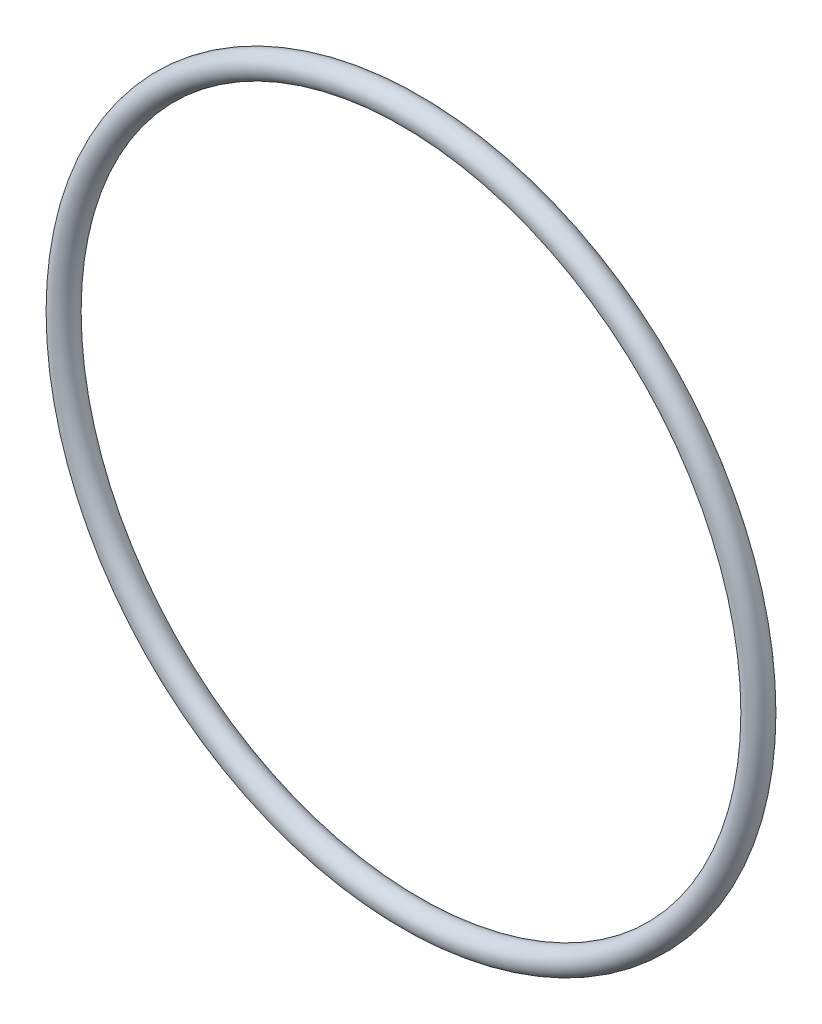
ISO-10303-21;
HEADER;
FILE_DESCRIPTION(('STEP AP214'),'2;1');
FILE_NAME('part.step','',(''),(''),'','','');
FILE_SCHEMA(('AUTOMOTIVE_DESIGN { 1 0 10303 214 1 1 1 1 }'));
ENDSEC;
DATA;
#1=APPLICATION_CONTEXT('core data for automotive mechanical design processes');
#2=APPLICATION_PROTOCOL_DEFINITION('international standard','automotive_design',2000,#1);
#3=PRODUCT_CONTEXT('',#1,'mechanical');
#4=PRODUCT('Part','Part','',(#3));
#5=PRODUCT_RELATED_PRODUCT_CATEGORY('part','',(#4));
#6=PRODUCT_DEFINITION_FORMATION('','',#4);
#7=PRODUCT_DEFINITION_CONTEXT('part definition',#1,'design');
#8=PRODUCT_DEFINITION('design','',#6,#7);
#9=PRODUCT_DEFINITION_SHAPE('','',#8);
#10=(LENGTH_UNIT() NAMED_UNIT(*) SI_UNIT(.MILLI.,.METRE.));
#11=(NAMED_UNIT(*) PLANE_ANGLE_UNIT() SI_UNIT($,.RADIAN.));
#12=(NAMED_UNIT(*) SI_UNIT($,.STERADIAN.) SOLID_ANGLE_UNIT());
#13=UNCERTAINTY_MEASURE_WITH_UNIT(LENGTH_MEASURE(1.E-05),#10,'distance_accuracy_value','');
#14=(GEOMETRIC_REPRESENTATION_CONTEXT(3) GLOBAL_UNCERTAINTY_ASSIGNED_CONTEXT((#13)) GLOBAL_UNIT_ASSIGNED_CONTEXT((#10,
#11,#12)) REPRESENTATION_CONTEXT('',''));
#15=CARTESIAN_POINT('',(0.,0.,0.));
#16=DIRECTION('',(0.,0.,1.));
#17=DIRECTION('',(1.,0.,0.));
#18=AXIS2_PLACEMENT_3D('',#15,#16,#17);
#19=CARTESIAN_POINT('',(0.,0.,0.));
#20=DIRECTION('',(0.,0.,1.));
#21=DIRECTION('',(1.,0.,0.));
#22=AXIS2_PLACEMENT_3D('',#19,#20,#21);
#23=TOROIDAL_SURFACE('',#22,42.,1.5);
#24=CARTESIAN_POINT('',(43.5,0.,0.));
#25=VERTEX_POINT('',#24);
#26=VERTEX_LOOP('',#25);
#27=FACE_BOUND('',#26,.T.);
#28=ADVANCED_FACE('F28',(#27),#23,.T.);
#29=CLOSED_SHELL('',(#28));
#30=MANIFOLD_SOLID_BREP('B2',#29);
#31=ADVANCED_BREP_SHAPE_REPRESENTATION('',(#18,#30),#14);
#32=SHAPE_DEFINITION_REPRESENTATION(#9,#31);
ENDSEC;
END-ISO-10303-21;
